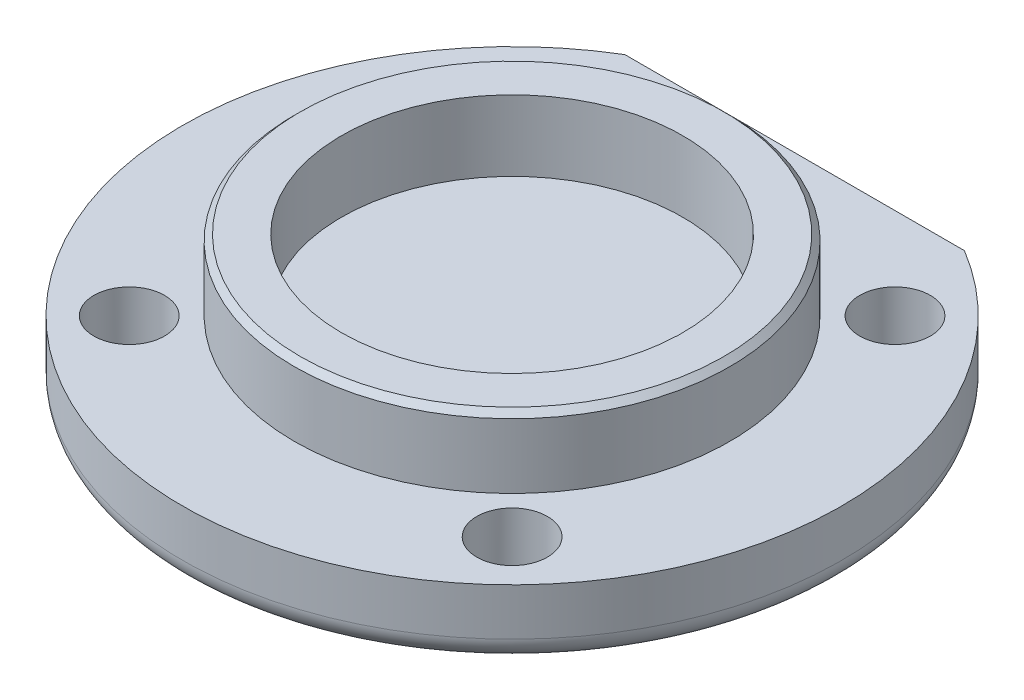
ISO-10303-21;
HEADER;
FILE_DESCRIPTION(('STEP AP214'),'2;1');
FILE_NAME('part.step','',(''),(''),'','','');
FILE_SCHEMA(('AUTOMOTIVE_DESIGN { 1 0 10303 214 1 1 1 1 }'));
ENDSEC;
DATA;
#1=APPLICATION_CONTEXT('core data for automotive mechanical design processes');
#2=APPLICATION_PROTOCOL_DEFINITION('international standard','automotive_design',2000,#1);
#3=PRODUCT_CONTEXT('',#1,'mechanical');
#4=PRODUCT('Part','Part','',(#3));
#5=PRODUCT_RELATED_PRODUCT_CATEGORY('part','',(#4));
#6=PRODUCT_DEFINITION_FORMATION('','',#4);
#7=PRODUCT_DEFINITION_CONTEXT('part definition',#1,'design');
#8=PRODUCT_DEFINITION('design','',#6,#7);
#9=PRODUCT_DEFINITION_SHAPE('','',#8);
#10=(LENGTH_UNIT() NAMED_UNIT(*) SI_UNIT(.MILLI.,.METRE.));
#11=(NAMED_UNIT(*) PLANE_ANGLE_UNIT() SI_UNIT($,.RADIAN.));
#12=(NAMED_UNIT(*) SI_UNIT($,.STERADIAN.) SOLID_ANGLE_UNIT());
#13=UNCERTAINTY_MEASURE_WITH_UNIT(LENGTH_MEASURE(1.E-05),#10,'distance_accuracy_value','');
#14=(GEOMETRIC_REPRESENTATION_CONTEXT(3) GLOBAL_UNCERTAINTY_ASSIGNED_CONTEXT((#13)) GLOBAL_UNIT_ASSIGNED_CONTEXT((#10,
#11,#12)) REPRESENTATION_CONTEXT('',''));
#15=CARTESIAN_POINT('',(0.,0.,0.));
#16=DIRECTION('',(0.,0.,1.));
#17=DIRECTION('',(1.,0.,0.));
#18=AXIS2_PLACEMENT_3D('',#15,#16,#17);
#19=CARTESIAN_POINT('',(0.,6.,0.));
#20=DIRECTION('',(0.,1.,0.));
#21=DIRECTION('',(0.,0.,1.));
#22=AXIS2_PLACEMENT_3D('',#19,#20,#21);
#23=PLANE('',#22);
#24=CARTESIAN_POINT('',(0.,6.,0.));
#25=DIRECTION('',(0.,1.,0.));
#26=DIRECTION('',(0.,0.,1.));
#27=AXIS2_PLACEMENT_3D('',#24,#25,#26);
#28=CIRCLE('',#27,18.5);
#29=CARTESIAN_POINT('',(0.,6.,18.5));
#30=VERTEX_POINT('',#29);
#31=EDGE_CURVE('E242',#30,#30,#28,.T.);
#32=ORIENTED_EDGE('',*,*,#31,.F.);
#33=EDGE_LOOP('',(#32));
#34=FACE_BOUND('',#33,.T.);
#35=CARTESIAN_POINT('',(16.2634559672906,6.,16.2634559672906));
#36=DIRECTION('',(0.,1.,0.));
#37=DIRECTION('',(0.,0.,1.));
#38=AXIS2_PLACEMENT_3D('',#35,#36,#37);
#39=CIRCLE('',#38,3.);
#40=CARTESIAN_POINT('',(16.2634559672906,6.,19.2634559672906));
#41=VERTEX_POINT('',#40);
#42=EDGE_CURVE('E257',#41,#41,#39,.T.);
#43=ORIENTED_EDGE('',*,*,#42,.F.);
#44=EDGE_LOOP('',(#43));
#45=FACE_BOUND('',#44,.T.);
#46=CARTESIAN_POINT('',(-16.2634559672906,6.,-16.2634559672906));
#47=DIRECTION('',(0.,1.,0.));
#48=DIRECTION('',(0.,0.,1.));
#49=AXIS2_PLACEMENT_3D('',#46,#47,#48);
#50=CIRCLE('',#49,3.);
#51=CARTESIAN_POINT('',(-16.2634559672906,6.,-13.2634559672906));
#52=VERTEX_POINT('',#51);
#53=EDGE_CURVE('E205',#52,#52,#50,.T.);
#54=ORIENTED_EDGE('',*,*,#53,.F.);
#55=EDGE_LOOP('',(#54));
#56=FACE_BOUND('',#55,.T.);
#57=CARTESIAN_POINT('',(0.,6.,0.));
#58=DIRECTION('',(0.,1.,0.));
#59=DIRECTION('',(0.,0.,1.));
#60=AXIS2_PLACEMENT_3D('',#57,#58,#59);
#61=CIRCLE('',#60,28.);
#62=CARTESIAN_POINT('',(-14.422205101856,6.,-24.));
#63=VERTEX_POINT('',#62);
#64=CARTESIAN_POINT('',(14.422205101856,6.,-24.));
#65=VERTEX_POINT('',#64);
#66=EDGE_CURVE('E104',#63,#65,#61,.T.);
#67=ORIENTED_EDGE('',*,*,#66,.T.);
#68=DIRECTION('',(-1.,0.,0.));
#69=VECTOR('',#68,1.);
#70=CARTESIAN_POINT('',(-14.422205101856,6.,-24.));
#71=LINE('',#70,#69);
#72=EDGE_CURVE('E94',#65,#63,#71,.T.);
#73=ORIENTED_EDGE('',*,*,#72,.T.);
#74=EDGE_LOOP('',(#67,#73));
#75=FACE_BOUND('',#74,.T.);
#76=CARTESIAN_POINT('',(16.2634559672906,6.,-16.2634559672906));
#77=DIRECTION('',(0.,1.,0.));
#78=DIRECTION('',(0.,0.,1.));
#79=AXIS2_PLACEMENT_3D('',#76,#77,#78);
#80=CIRCLE('',#79,2.99999999999999);
#81=CARTESIAN_POINT('',(16.2634559672906,6.,-13.2634559672906));
#82=VERTEX_POINT('',#81);
#83=EDGE_CURVE('E211',#82,#82,#80,.T.);
#84=ORIENTED_EDGE('',*,*,#83,.F.);
#85=EDGE_LOOP('',(#84));
#86=FACE_BOUND('',#85,.T.);
#87=CARTESIAN_POINT('',(-16.2634559672906,6.,16.2634559672906));
#88=DIRECTION('',(0.,1.,0.));
#89=DIRECTION('',(0.,0.,1.));
#90=AXIS2_PLACEMENT_3D('',#87,#88,#89);
#91=CIRCLE('',#90,3.);
#92=CARTESIAN_POINT('',(-16.2634559672906,6.,19.2634559672906));
#93=VERTEX_POINT('',#92);
#94=EDGE_CURVE('E249',#93,#93,#91,.T.);
#95=ORIENTED_EDGE('',*,*,#94,.F.);
#96=EDGE_LOOP('',(#95));
#97=FACE_BOUND('',#96,.T.);
#98=ADVANCED_FACE('F45',(#34,#45,#56,#75,#86,#97),#23,.T.);
#99=CARTESIAN_POINT('',(0.,0.,0.));
#100=DIRECTION('',(0.,1.,0.));
#101=DIRECTION('',(0.,0.,1.));
#102=AXIS2_PLACEMENT_3D('',#99,#100,#101);
#103=PLANE('',#102);
#104=DIRECTION('',(-1.,0.,0.));
#105=VECTOR('',#104,1.);
#106=CARTESIAN_POINT('',(-14.422205101856,0.,-24.));
#107=LINE('',#106,#105);
#108=CARTESIAN_POINT('',(10.,0.,-24.));
#109=VERTEX_POINT('',#108);
#110=CARTESIAN_POINT('',(-10.,0.,-24.));
#111=VERTEX_POINT('',#110);
#112=EDGE_CURVE('E109',#109,#111,#107,.T.);
#113=ORIENTED_EDGE('',*,*,#112,.F.);
#114=CARTESIAN_POINT('',(0.,0.,0.));
#115=DIRECTION('',(0.,1.,0.));
#116=DIRECTION('',(0.,0.,1.));
#117=AXIS2_PLACEMENT_3D('',#114,#115,#116);
#118=CIRCLE('',#117,26.);
#119=CARTESIAN_POINT('',(18.3847763108503,0.,-18.3847763108502));
#120=VERTEX_POINT('',#119);
#121=EDGE_CURVE('E228',#109,#120,#118,.F.);
#122=ORIENTED_EDGE('',*,*,#121,.T.);
#123=CARTESIAN_POINT('',(16.2634559672906,0.,-16.2634559672906));
#124=DIRECTION('',(0.,1.,0.));
#125=DIRECTION('',(0.,0.,1.));
#126=AXIS2_PLACEMENT_3D('',#123,#124,#125);
#127=CIRCLE('',#126,2.99999999999999);
#128=EDGE_CURVE('E261',#120,#120,#127,.T.);
#129=ORIENTED_EDGE('',*,*,#128,.T.);
#130=CARTESIAN_POINT('',(0.,0.,0.));
#131=DIRECTION('',(0.,1.,0.));
#132=DIRECTION('',(0.,0.,1.));
#133=AXIS2_PLACEMENT_3D('',#130,#131,#132);
#134=CIRCLE('',#133,26.);
#135=CARTESIAN_POINT('',(18.3847763108502,0.,18.3847763108503));
#136=VERTEX_POINT('',#135);
#137=EDGE_CURVE('E67',#120,#136,#134,.F.);
#138=ORIENTED_EDGE('',*,*,#137,.T.);
#139=CARTESIAN_POINT('',(16.2634559672906,0.,16.2634559672906));
#140=DIRECTION('',(0.,1.,0.));
#141=DIRECTION('',(0.,0.,1.));
#142=AXIS2_PLACEMENT_3D('',#139,#140,#141);
#143=CIRCLE('',#142,3.);
#144=EDGE_CURVE('E255',#136,#136,#143,.T.);
#145=ORIENTED_EDGE('',*,*,#144,.T.);
#146=CARTESIAN_POINT('',(0.,0.,0.));
#147=DIRECTION('',(0.,1.,0.));
#148=DIRECTION('',(0.,0.,1.));
#149=AXIS2_PLACEMENT_3D('',#146,#147,#148);
#150=CIRCLE('',#149,26.);
#151=CARTESIAN_POINT('',(-18.3847763108503,0.,18.3847763108502));
#152=VERTEX_POINT('',#151);
#153=EDGE_CURVE('E62',#136,#152,#150,.F.);
#154=ORIENTED_EDGE('',*,*,#153,.T.);
#155=CARTESIAN_POINT('',(-16.2634559672906,0.,16.2634559672906));
#156=DIRECTION('',(0.,1.,0.));
#157=DIRECTION('',(0.,0.,1.));
#158=AXIS2_PLACEMENT_3D('',#155,#156,#157);
#159=CIRCLE('',#158,3.);
#160=EDGE_CURVE('E244',#152,#152,#159,.T.);
#161=ORIENTED_EDGE('',*,*,#160,.T.);
#162=CARTESIAN_POINT('',(0.,0.,0.));
#163=DIRECTION('',(0.,1.,0.));
#164=DIRECTION('',(0.,0.,1.));
#165=AXIS2_PLACEMENT_3D('',#162,#163,#164);
#166=CIRCLE('',#165,26.);
#167=CARTESIAN_POINT('',(-18.3847763108502,0.,-18.3847763108503));
#168=VERTEX_POINT('',#167);
#169=EDGE_CURVE('E216',#152,#168,#166,.F.);
#170=ORIENTED_EDGE('',*,*,#169,.T.);
#171=CARTESIAN_POINT('',(-16.2634559672906,0.,-16.2634559672906));
#172=DIRECTION('',(0.,1.,0.));
#173=DIRECTION('',(0.,0.,1.));
#174=AXIS2_PLACEMENT_3D('',#171,#172,#173);
#175=CIRCLE('',#174,3.);
#176=EDGE_CURVE('E208',#168,#168,#175,.T.);
#177=ORIENTED_EDGE('',*,*,#176,.T.);
#178=CARTESIAN_POINT('',(0.,0.,0.));
#179=DIRECTION('',(0.,1.,0.));
#180=DIRECTION('',(0.,0.,1.));
#181=AXIS2_PLACEMENT_3D('',#178,#179,#180);
#182=CIRCLE('',#181,26.);
#183=EDGE_CURVE('E215',#168,#111,#182,.F.);
#184=ORIENTED_EDGE('',*,*,#183,.T.);
#185=EDGE_LOOP('',(#113,#122,#129,#138,#145,#154,#161,#170,#177,#184));
#186=FACE_BOUND('',#185,.T.);
#187=ADVANCED_FACE('F148',(#186),#103,.F.);
#188=CARTESIAN_POINT('',(0.,6.,0.));
#189=DIRECTION('',(0.,-1.,0.));
#190=DIRECTION('',(0.,0.,-1.));
#191=AXIS2_PLACEMENT_3D('',#188,#189,#190);
#192=CYLINDRICAL_SURFACE('',#191,28.);
#193=DIRECTION('',(0.,-1.,0.));
#194=VECTOR('',#193,1.);
#195=CARTESIAN_POINT('',(-14.422205101856,6.,-24.));
#196=LINE('',#195,#194);
#197=CARTESIAN_POINT('',(-14.422205101856,2.,-24.));
#198=VERTEX_POINT('',#197);
#199=EDGE_CURVE('E100',#63,#198,#196,.T.);
#200=ORIENTED_EDGE('',*,*,#199,.T.);
#201=CARTESIAN_POINT('',(0.,2.,0.));
#202=DIRECTION('',(0.,1.,0.));
#203=DIRECTION('',(0.,0.,1.));
#204=AXIS2_PLACEMENT_3D('',#201,#202,#203);
#205=CIRCLE('',#204,28.);
#206=CARTESIAN_POINT('',(14.422205101856,2.,-24.));
#207=VERTEX_POINT('',#206);
#208=EDGE_CURVE('E114',#198,#207,#205,.T.);
#209=ORIENTED_EDGE('',*,*,#208,.T.);
#210=DIRECTION('',(0.,-1.,0.));
#211=VECTOR('',#210,1.);
#212=CARTESIAN_POINT('',(14.422205101856,6.,-24.));
#213=LINE('',#212,#211);
#214=EDGE_CURVE('E98',#65,#207,#213,.T.);
#215=ORIENTED_EDGE('',*,*,#214,.F.);
#216=ORIENTED_EDGE('',*,*,#66,.F.);
#217=EDGE_LOOP('',(#200,#209,#215,#216));
#218=FACE_BOUND('',#217,.T.);
#219=ADVANCED_FACE('F112',(#218),#192,.T.);
#220=CARTESIAN_POINT('',(-14.422205101856,6.,-24.));
#221=DIRECTION('',(0.,0.,1.));
#222=DIRECTION('',(1.,0.,0.));
#223=AXIS2_PLACEMENT_3D('',#220,#221,#222);
#224=PLANE('',#223);
#225=ORIENTED_EDGE('',*,*,#214,.T.);
#226=CARTESIAN_POINT('',(14.422205101856,2.,-24.));
#227=CARTESIAN_POINT('',(14.422211890367,1.9690932926604,-24.));
#228=CARTESIAN_POINT('',(14.420813036715,1.93820385487096,-24.));
#229=CARTESIAN_POINT('',(14.4152770758335,1.87669609611049,-24.));
#230=CARTESIAN_POINT('',(14.4111422139189,1.84607757367367,-24.));
#231=CARTESIAN_POINT('',(14.394841681709,1.75547468890507,-24.));
#232=CARTESIAN_POINT('',(14.3787770434907,1.69615784938234,-24.));
#233=CARTESIAN_POINT('',(14.3375899831283,1.58105476953537,-24.));
#234=CARTESIAN_POINT('',(14.3124946758918,1.52525854170707,-24.));
#235=CARTESIAN_POINT('',(14.2548104502969,1.41758518830682,-24.));
#236=CARTESIAN_POINT('',(14.2222041949474,1.36571750458672,-24.));
#237=CARTESIAN_POINT('',(14.1265823410536,1.23201704029912,-24.));
#238=CARTESIAN_POINT('',(14.0580785761005,1.1541180589017,-24.));
#239=CARTESIAN_POINT('',(13.9099498702443,1.00974295551642,-24.));
#240=CARTESIAN_POINT('',(13.8302940140492,0.943299774162362,-24.));
#241=CARTESIAN_POINT('',(13.6746157968722,0.828553683596501,-24.));
#242=CARTESIAN_POINT('',(13.5994878281349,0.77901448821339,-24.));
#243=CARTESIAN_POINT('',(13.445227870903,0.686551557392009,-24.));
#244=CARTESIAN_POINT('',(13.3660928106192,0.643633002443718,-24.));
#245=CARTESIAN_POINT('',(13.2048406574864,0.563554751261531,-24.));
#246=CARTESIAN_POINT('',(13.1227192603197,0.526403809883393,-24.));
#247=CARTESIAN_POINT('',(12.9563326162444,0.457225019762812,-24.));
#248=CARTESIAN_POINT('',(12.8720665557514,0.425199149845689,-24.));
#249=CARTESIAN_POINT('',(12.6145417904432,0.335083437308462,-24.));
#250=CARTESIAN_POINT('',(12.4388113335606,0.284026155312558,-24.));
#251=CARTESIAN_POINT('',(12.0836658195436,0.196741435354473,-24.));
#252=CARTESIAN_POINT('',(11.9042470397217,0.160529839638069,-24.));
#253=CARTESIAN_POINT('',(11.5431723858595,0.1003074382004,-24.));
#254=CARTESIAN_POINT('',(11.361513892933,0.0763126511732615,-24.));
#255=CARTESIAN_POINT('',(10.9972533924113,0.0386271253607455,-24.));
#256=CARTESIAN_POINT('',(10.8146518902829,0.0249313476751565,-24.));
#257=CARTESIAN_POINT('',(10.5264316091931,0.0102559171560057,-24.));
#258=CARTESIAN_POINT('',(10.4209481182396,0.00634753423713788,-24.));
#259=CARTESIAN_POINT('',(10.2103092578833,0.00122664031751573,-24.));
#260=CARTESIAN_POINT('',(10.1051541357616,4.10724353054597E-06,-24.));
#261=CARTESIAN_POINT('',(10.,0.,-24.));
#262=B_SPLINE_CURVE_WITH_KNOTS('',3,(#226,#227,#228,#229,#230,#231,#232,#233,#234,#235,#236,
#237,#238,#239,#240,#241,#242,#243,#244,#245,#246,#247,#248,#249,#250,#251,#252,#253,#254,#255,
#256,#257,#258,#259,#260,#261),.UNSPECIFIED.,.F.,.F.,(4,2,2,2,2,2,2,2,2,2,2,2,2,2,2,2,2,4),(0.,
0.0926561195277471,0.185236294629758,0.368665771618148,0.551549028525037,0.734858728622758,
1.04427898924628,1.3545746498688,1.62416031917903,1.89395587424876,2.16415703915647,
2.43446228018298,2.98251826210761,3.53115757701037,4.0805144277004,4.6296023245013,
4.94624002128934,5.26169418402157),.UNSPECIFIED.);
#263=EDGE_CURVE('E135',#207,#109,#262,.T.);
#264=ORIENTED_EDGE('',*,*,#263,.T.);
#265=ORIENTED_EDGE('',*,*,#112,.T.);
#266=CARTESIAN_POINT('',(-10.,0.,-24.));
#267=CARTESIAN_POINT('',(-10.1018035780771,3.07200612548802E-06,-24.));
#268=CARTESIAN_POINT('',(-10.203604787611,0.001149416146582,-24.));
#269=CARTESIAN_POINT('',(-10.4071675661431,0.00593467637755516,-24.));
#270=CARTESIAN_POINT('',(-10.5089291235859,0.00957407704341256,-24.));
#271=CARTESIAN_POINT('',(-10.8147830683118,0.0245767410307728,-24.));
#272=CARTESIAN_POINT('',(-11.0187025306177,0.0400275139808889,-24.));
#273=CARTESIAN_POINT('',(-11.426731040302,0.0840773379151131,-24.));
#274=CARTESIAN_POINT('',(-11.6308294690502,0.112776662266249,-24.));
#275=CARTESIAN_POINT('',(-12.0359296678532,0.186223310926808,-24.));
#276=CARTESIAN_POINT('',(-12.2369361531219,0.230942996539833,-24.));
#277=CARTESIAN_POINT('',(-12.5008174347036,0.303912189646677,-24.));
#278=CARTESIAN_POINT('',(-12.5662054481151,0.323187270749807,-24.));
#279=CARTESIAN_POINT('',(-12.6962182017819,0.364166863358106,-24.));
#280=CARTESIAN_POINT('',(-12.7608429005101,0.385871506373295,-24.));
#281=CARTESIAN_POINT('',(-12.9533262914629,0.454956219346026,-24.));
#282=CARTESIAN_POINT('',(-13.0798088936592,0.506310999131098,-24.));
#283=CARTESIAN_POINT('',(-13.3278472418532,0.622208831992641,-24.));
#284=CARTESIAN_POINT('',(-13.4493576398573,0.686850231294321,-24.));
#285=CARTESIAN_POINT('',(-13.6825584901509,0.831967312703516,-24.));
#286=CARTESIAN_POINT('',(-13.7942726022138,0.912403234186221,-24.));
#287=CARTESIAN_POINT('',(-13.956182321669,1.05342004393603,-24.));
#288=CARTESIAN_POINT('',(-14.0120393290571,1.10747361995611,-24.));
#289=CARTESIAN_POINT('',(-14.1164777880637,1.22238506979338,-24.));
#290=CARTESIAN_POINT('',(-14.1650551200164,1.28324676264781,-24.));
#291=CARTESIAN_POINT('',(-14.252772237965,1.41274003672604,-24.));
#292=CARTESIAN_POINT('',(-14.2917786248316,1.48146378246638,-24.));
#293=CARTESIAN_POINT('',(-14.3559094268943,1.62502107692112,-24.));
#294=CARTESIAN_POINT('',(-14.381089915816,1.6998285120283,-24.));
#295=CARTESIAN_POINT('',(-14.4058686965395,1.81305501155579,-24.));
#296=CARTESIAN_POINT('',(-14.411960136057,1.85011656898911,-24.));
#297=CARTESIAN_POINT('',(-14.4201406318369,1.92477340427182,-24.));
#298=CARTESIAN_POINT('',(-14.4222193463519,1.96236981030372,-24.));
#299=CARTESIAN_POINT('',(-14.422205101856,2.,-24.));
#300=B_SPLINE_CURVE_WITH_KNOTS('',3,(#266,#267,#268,#269,#270,#271,#272,#273,#274,#275,#276,
#277,#278,#279,#280,#281,#282,#283,#284,#285,#286,#287,#288,#289,#290,#291,#292,#293,#294,#295,
#296,#297,#298,#299),.UNSPECIFIED.,.F.,.F.,(4,2,2,2,2,2,2,2,2,2,2,2,2,2,2,2,4),(0.,
0.305396822040169,0.610853020903097,1.22398950966874,1.84184466570159,2.45863897697082,
2.66310829103745,2.86758867820275,3.27650417263968,3.68856308361815,4.09959769007842,
4.33229422542965,4.56512195357478,4.80103081254593,5.03597569197336,5.14845753995949,
5.26122889542907),.UNSPECIFIED.);
#301=EDGE_CURVE('E127',#111,#198,#300,.T.);
#302=ORIENTED_EDGE('',*,*,#301,.T.);
#303=ORIENTED_EDGE('',*,*,#199,.F.);
#304=ORIENTED_EDGE('',*,*,#72,.F.);
#305=EDGE_LOOP('',(#225,#264,#265,#302,#303,#304));
#306=FACE_BOUND('',#305,.T.);
#307=ADVANCED_FACE('F96',(#306),#224,.F.);
#308=CARTESIAN_POINT('',(-16.2634559672906,6.,-16.2634559672906));
#309=DIRECTION('',(0.,-1.,0.));
#310=DIRECTION('',(0.,0.,-1.));
#311=AXIS2_PLACEMENT_3D('',#308,#309,#310);
#312=CYLINDRICAL_SURFACE('',#311,3.);
#313=ORIENTED_EDGE('',*,*,#53,.T.);
#314=EDGE_LOOP('',(#313));
#315=FACE_BOUND('',#314,.T.);
#316=ORIENTED_EDGE('',*,*,#176,.F.);
#317=EDGE_LOOP('',(#316));
#318=FACE_BOUND('',#317,.T.);
#319=ADVANCED_FACE('F147',(#315,#318),#312,.F.);
#320=CARTESIAN_POINT('',(16.2634559672906,6.,-16.2634559672906));
#321=DIRECTION('',(0.,-1.,0.));
#322=DIRECTION('',(0.,0.,-1.));
#323=AXIS2_PLACEMENT_3D('',#320,#321,#322);
#324=CYLINDRICAL_SURFACE('',#323,2.99999999999999);
#325=ORIENTED_EDGE('',*,*,#83,.T.);
#326=EDGE_LOOP('',(#325));
#327=FACE_BOUND('',#326,.T.);
#328=ORIENTED_EDGE('',*,*,#128,.F.);
#329=EDGE_LOOP('',(#328));
#330=FACE_BOUND('',#329,.T.);
#331=ADVANCED_FACE('F194',(#327,#330),#324,.F.);
#332=CARTESIAN_POINT('',(16.2634559672906,6.,16.2634559672906));
#333=DIRECTION('',(0.,-1.,0.));
#334=DIRECTION('',(0.,0.,-1.));
#335=AXIS2_PLACEMENT_3D('',#332,#333,#334);
#336=CYLINDRICAL_SURFACE('',#335,3.);
#337=ORIENTED_EDGE('',*,*,#42,.T.);
#338=EDGE_LOOP('',(#337));
#339=FACE_BOUND('',#338,.T.);
#340=ORIENTED_EDGE('',*,*,#144,.F.);
#341=EDGE_LOOP('',(#340));
#342=FACE_BOUND('',#341,.T.);
#343=ADVANCED_FACE('F190',(#339,#342),#336,.F.);
#344=CARTESIAN_POINT('',(-16.2634559672906,6.,16.2634559672906));
#345=DIRECTION('',(0.,-1.,0.));
#346=DIRECTION('',(0.,0.,-1.));
#347=AXIS2_PLACEMENT_3D('',#344,#345,#346);
#348=CYLINDRICAL_SURFACE('',#347,3.);
#349=ORIENTED_EDGE('',*,*,#94,.T.);
#350=EDGE_LOOP('',(#349));
#351=FACE_BOUND('',#350,.T.);
#352=ORIENTED_EDGE('',*,*,#160,.F.);
#353=EDGE_LOOP('',(#352));
#354=FACE_BOUND('',#353,.T.);
#355=ADVANCED_FACE('F185',(#351,#354),#348,.F.);
#356=CARTESIAN_POINT('',(0.,12.,0.));
#357=DIRECTION('',(0.,1.,0.));
#358=DIRECTION('',(0.,0.,1.));
#359=AXIS2_PLACEMENT_3D('',#356,#357,#358);
#360=PLANE('',#359);
#361=CARTESIAN_POINT('',(0.,12.,0.));
#362=DIRECTION('',(0.,1.,0.));
#363=DIRECTION('',(0.,0.,1.));
#364=AXIS2_PLACEMENT_3D('',#361,#362,#363);
#365=CIRCLE('',#364,18.);
#366=CARTESIAN_POINT('',(0.,12.,18.));
#367=VERTEX_POINT('',#366);
#368=EDGE_CURVE('E55',#367,#367,#365,.T.);
#369=ORIENTED_EDGE('',*,*,#368,.T.);
#370=EDGE_LOOP('',(#369));
#371=FACE_BOUND('',#370,.T.);
#372=CARTESIAN_POINT('',(0.,12.,0.));
#373=DIRECTION('',(0.,1.,0.));
#374=DIRECTION('',(0.,0.,1.));
#375=AXIS2_PLACEMENT_3D('',#372,#373,#374);
#376=CIRCLE('',#375,14.5);
#377=CARTESIAN_POINT('',(0.,12.,14.5));
#378=VERTEX_POINT('',#377);
#379=EDGE_CURVE('E245',#378,#378,#376,.T.);
#380=ORIENTED_EDGE('',*,*,#379,.F.);
#381=EDGE_LOOP('',(#380));
#382=FACE_BOUND('',#381,.T.);
#383=ADVANCED_FACE('F179',(#371,#382),#360,.T.);
#384=CARTESIAN_POINT('',(0.,12.,0.));
#385=DIRECTION('',(0.,-1.,0.));
#386=DIRECTION('',(0.,0.,-1.));
#387=AXIS2_PLACEMENT_3D('',#384,#385,#386);
#388=CYLINDRICAL_SURFACE('',#387,18.5);
#389=CARTESIAN_POINT('',(0.,11.5,0.));
#390=DIRECTION('',(0.,1.,0.));
#391=DIRECTION('',(0.,0.,1.));
#392=AXIS2_PLACEMENT_3D('',#389,#390,#391);
#393=CIRCLE('',#392,18.5);
#394=CARTESIAN_POINT('',(0.,11.5,18.5));
#395=VERTEX_POINT('',#394);
#396=EDGE_CURVE('E11',#395,#395,#393,.F.);
#397=ORIENTED_EDGE('',*,*,#396,.T.);
#398=EDGE_LOOP('',(#397));
#399=FACE_BOUND('',#398,.T.);
#400=ORIENTED_EDGE('',*,*,#31,.T.);
#401=EDGE_LOOP('',(#400));
#402=FACE_BOUND('',#401,.T.);
#403=ADVANCED_FACE('F171',(#399,#402),#388,.T.);
#404=CARTESIAN_POINT('',(0.,12.,0.));
#405=DIRECTION('',(0.,-1.,0.));
#406=DIRECTION('',(0.,0.,-1.));
#407=AXIS2_PLACEMENT_3D('',#404,#405,#406);
#408=CYLINDRICAL_SURFACE('',#407,14.5);
#409=ORIENTED_EDGE('',*,*,#379,.T.);
#410=EDGE_LOOP('',(#409));
#411=FACE_BOUND('',#410,.T.);
#412=CARTESIAN_POINT('',(0.,6.,0.));
#413=DIRECTION('',(0.,1.,0.));
#414=DIRECTION('',(0.,0.,1.));
#415=AXIS2_PLACEMENT_3D('',#412,#413,#414);
#416=CIRCLE('',#415,14.5);
#417=CARTESIAN_POINT('',(0.,6.,14.5));
#418=VERTEX_POINT('',#417);
#419=EDGE_CURVE('E116',#418,#418,#416,.F.);
#420=ORIENTED_EDGE('',*,*,#419,.T.);
#421=EDGE_LOOP('',(#420));
#422=FACE_BOUND('',#421,.T.);
#423=ADVANCED_FACE('F164',(#411,#422),#408,.F.);
#424=ORIENTED_EDGE('',*,*,#419,.F.);
#425=EDGE_LOOP('',(#424));
#426=FACE_BOUND('',#425,.T.);
#427=ADVANCED_FACE('F157',(#426),#23,.T.);
#428=CARTESIAN_POINT('',(0.,2.,0.));
#429=DIRECTION('',(0.,1.,0.));
#430=DIRECTION('',(0.,0.,1.));
#431=AXIS2_PLACEMENT_3D('',#428,#429,#430);
#432=TOROIDAL_SURFACE('',#431,26.,2.);
#433=ORIENTED_EDGE('',*,*,#137,.F.);
#434=ORIENTED_EDGE('',*,*,#121,.F.);
#435=ORIENTED_EDGE('',*,*,#263,.F.);
#436=ORIENTED_EDGE('',*,*,#208,.F.);
#437=ORIENTED_EDGE('',*,*,#301,.F.);
#438=ORIENTED_EDGE('',*,*,#183,.F.);
#439=ORIENTED_EDGE('',*,*,#169,.F.);
#440=ORIENTED_EDGE('',*,*,#153,.F.);
#441=EDGE_LOOP('',(#433,#434,#435,#436,#437,#438,#439,#440));
#442=FACE_BOUND('',#441,.T.);
#443=ADVANCED_FACE('F141',(#442),#432,.T.);
#444=CARTESIAN_POINT('',(0.,12.,0.));
#445=DIRECTION('',(0.,-1.,0.));
#446=DIRECTION('',(0.,0.,-1.));
#447=AXIS2_PLACEMENT_3D('',#444,#445,#446);
#448=CONICAL_SURFACE('',#447,18.,0.785398163397452);
#449=ORIENTED_EDGE('',*,*,#396,.F.);
#450=EDGE_LOOP('',(#449));
#451=FACE_BOUND('',#450,.T.);
#452=ORIENTED_EDGE('',*,*,#368,.F.);
#453=EDGE_LOOP('',(#452));
#454=FACE_BOUND('',#453,.T.);
#455=ADVANCED_FACE('F48',(#451,#454),#448,.T.);
#456=CLOSED_SHELL('',(#98,#187,#219,#307,#319,#331,#343,#355,#383,#403,#423,#427,#443,#455));
#457=MANIFOLD_SOLID_BREP('B2',#456);
#458=ADVANCED_BREP_SHAPE_REPRESENTATION('',(#18,#457),#14);
#459=SHAPE_DEFINITION_REPRESENTATION(#9,#458);
ENDSEC;
END-ISO-10303-21;
